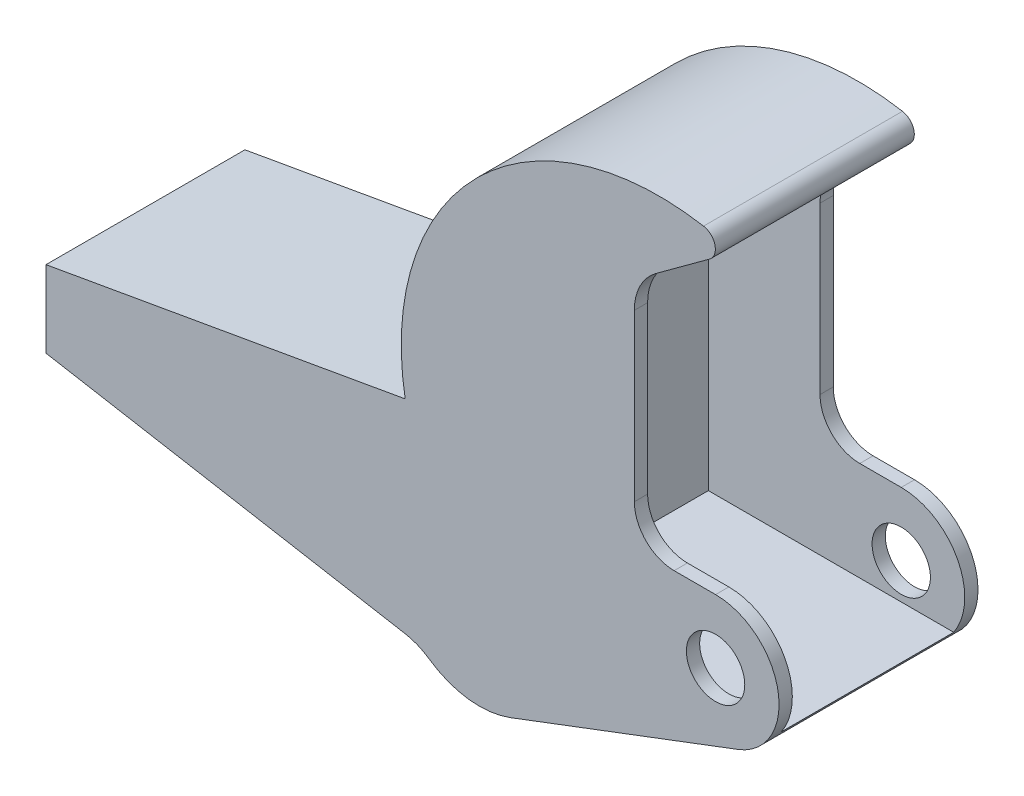
ISO-10303-21;
HEADER;
FILE_DESCRIPTION(('STEP AP214'),'2;1');
FILE_NAME('part.step','',(''),(''),'','','');
FILE_SCHEMA(('AUTOMOTIVE_DESIGN { 1 0 10303 214 1 1 1 1 }'));
ENDSEC;
DATA;
#1=APPLICATION_CONTEXT('core data for automotive mechanical design processes');
#2=APPLICATION_PROTOCOL_DEFINITION('international standard','automotive_design',2000,#1);
#3=PRODUCT_CONTEXT('',#1,'mechanical');
#4=PRODUCT('Part','Part','',(#3));
#5=PRODUCT_RELATED_PRODUCT_CATEGORY('part','',(#4));
#6=PRODUCT_DEFINITION_FORMATION('','',#4);
#7=PRODUCT_DEFINITION_CONTEXT('part definition',#1,'design');
#8=PRODUCT_DEFINITION('design','',#6,#7);
#9=PRODUCT_DEFINITION_SHAPE('','',#8);
#10=(LENGTH_UNIT() NAMED_UNIT(*) SI_UNIT(.MILLI.,.METRE.));
#11=(NAMED_UNIT(*) PLANE_ANGLE_UNIT() SI_UNIT($,.RADIAN.));
#12=(NAMED_UNIT(*) SI_UNIT($,.STERADIAN.) SOLID_ANGLE_UNIT());
#13=UNCERTAINTY_MEASURE_WITH_UNIT(LENGTH_MEASURE(1.E-05),#10,'distance_accuracy_value','');
#14=(GEOMETRIC_REPRESENTATION_CONTEXT(3) GLOBAL_UNCERTAINTY_ASSIGNED_CONTEXT((#13)) GLOBAL_UNIT_ASSIGNED_CONTEXT((#10,
#11,#12)) REPRESENTATION_CONTEXT('',''));
#15=CARTESIAN_POINT('',(0.,0.,0.));
#16=DIRECTION('',(0.,0.,1.));
#17=DIRECTION('',(1.,0.,0.));
#18=AXIS2_PLACEMENT_3D('',#15,#16,#17);
#19=CARTESIAN_POINT('',(52.8386271792986,13.1794672093716,30.));
#20=DIRECTION('',(0.,-1.,0.));
#21=DIRECTION('',(0.,0.,-1.));
#22=AXIS2_PLACEMENT_3D('',#19,#20,#21);
#23=PLANE('',#22);
#24=DIRECTION('',(0.,0.,-1.));
#25=VECTOR('',#24,1.);
#26=CARTESIAN_POINT('',(59.0886271792986,13.1794672093716,30.));
#27=LINE('',#26,#25);
#28=CARTESIAN_POINT('',(59.0886271792986,13.1794672093716,30.));
#29=VERTEX_POINT('',#28);
#30=CARTESIAN_POINT('',(59.0886271792986,13.1794672093716,28.));
#31=VERTEX_POINT('',#30);
#32=EDGE_CURVE('E268',#29,#31,#27,.T.);
#33=ORIENTED_EDGE('',*,*,#32,.T.);
#34=DIRECTION('',(-1.,0.,0.));
#35=VECTOR('',#34,1.);
#36=CARTESIAN_POINT('',(52.8386271792986,13.1794672093716,28.));
#37=LINE('',#36,#35);
#38=CARTESIAN_POINT('',(52.8386271792986,13.1794672093716,28.));
#39=VERTEX_POINT('',#38);
#40=EDGE_CURVE('E385',#31,#39,#37,.T.);
#41=ORIENTED_EDGE('',*,*,#40,.T.);
#42=DIRECTION('',(0.,0.,-1.));
#43=VECTOR('',#42,1.);
#44=CARTESIAN_POINT('',(52.8386271792986,13.1794672093716,30.));
#45=LINE('',#44,#43);
#46=CARTESIAN_POINT('',(52.8386271792986,13.1794672093716,30.));
#47=VERTEX_POINT('',#46);
#48=EDGE_CURVE('E263',#47,#39,#45,.T.);
#49=ORIENTED_EDGE('',*,*,#48,.F.);
#50=DIRECTION('',(-1.,0.,0.));
#51=VECTOR('',#50,1.);
#52=CARTESIAN_POINT('',(52.8386271792986,13.1794672093716,30.));
#53=LINE('',#52,#51);
#54=EDGE_CURVE('E416',#29,#47,#53,.T.);
#55=ORIENTED_EDGE('',*,*,#54,.F.);
#56=EDGE_LOOP('',(#33,#41,#49,#55));
#57=FACE_BOUND('',#56,.T.);
#58=ADVANCED_FACE('F43',(#57),#23,.F.);
#59=CARTESIAN_POINT('',(52.8386271792986,19.1794672093716,30.));
#60=DIRECTION('',(0.,0.,-1.));
#61=DIRECTION('',(-1.,0.,0.));
#62=AXIS2_PLACEMENT_3D('',#59,#60,#61);
#63=CYLINDRICAL_SURFACE('',#62,6.);
#64=ORIENTED_EDGE('',*,*,#48,.T.);
#65=CARTESIAN_POINT('',(52.8386271792986,19.1794672093716,28.));
#66=DIRECTION('',(0.,0.,1.));
#67=DIRECTION('',(0.,-1.,0.));
#68=AXIS2_PLACEMENT_3D('',#65,#66,#67);
#69=CIRCLE('',#68,6.);
#70=CARTESIAN_POINT('',(46.8386271792986,19.1794672093716,28.));
#71=VERTEX_POINT('',#70);
#72=EDGE_CURVE('E381',#39,#71,#69,.F.);
#73=ORIENTED_EDGE('',*,*,#72,.T.);
#74=DIRECTION('',(0.,0.,-1.));
#75=VECTOR('',#74,1.);
#76=CARTESIAN_POINT('',(46.8386271792986,19.1794672093716,30.));
#77=LINE('',#76,#75);
#78=CARTESIAN_POINT('',(46.8386271792986,19.1794672093716,30.));
#79=VERTEX_POINT('',#78);
#80=EDGE_CURVE('E258',#79,#71,#77,.T.);
#81=ORIENTED_EDGE('',*,*,#80,.F.);
#82=CARTESIAN_POINT('',(52.8386271792986,19.1794672093716,30.));
#83=DIRECTION('',(0.,0.,-1.));
#84=DIRECTION('',(1.,0.,0.));
#85=AXIS2_PLACEMENT_3D('',#82,#83,#84);
#86=CIRCLE('',#85,6.);
#87=EDGE_CURVE('E419',#47,#79,#86,.T.);
#88=ORIENTED_EDGE('',*,*,#87,.F.);
#89=EDGE_LOOP('',(#64,#73,#81,#88));
#90=FACE_BOUND('',#89,.T.);
#91=ADVANCED_FACE('F471',(#90),#63,.F.);
#92=CARTESIAN_POINT('',(46.8386271792986,44.1794672093716,30.));
#93=DIRECTION('',(-1.,0.,0.));
#94=DIRECTION('',(0.,0.,1.));
#95=AXIS2_PLACEMENT_3D('',#92,#93,#94);
#96=PLANE('',#95);
#97=ORIENTED_EDGE('',*,*,#80,.T.);
#98=DIRECTION('',(0.,1.,0.));
#99=VECTOR('',#98,1.);
#100=CARTESIAN_POINT('',(46.8386271792986,44.1794672093716,28.));
#101=LINE('',#100,#99);
#102=CARTESIAN_POINT('',(46.8386271792986,44.1794672093716,28.));
#103=VERTEX_POINT('',#102);
#104=EDGE_CURVE('E377',#71,#103,#101,.T.);
#105=ORIENTED_EDGE('',*,*,#104,.T.);
#106=DIRECTION('',(0.,0.,-1.));
#107=VECTOR('',#106,1.);
#108=CARTESIAN_POINT('',(46.8386271792986,44.1794672093716,30.));
#109=LINE('',#108,#107);
#110=CARTESIAN_POINT('',(46.8386271792986,44.1794672093716,30.));
#111=VERTEX_POINT('',#110);
#112=EDGE_CURVE('E253',#111,#103,#109,.T.);
#113=ORIENTED_EDGE('',*,*,#112,.F.);
#114=DIRECTION('',(0.,1.,0.));
#115=VECTOR('',#114,1.);
#116=CARTESIAN_POINT('',(46.8386271792986,44.1794672093716,30.));
#117=LINE('',#116,#115);
#118=EDGE_CURVE('E422',#79,#111,#117,.T.);
#119=ORIENTED_EDGE('',*,*,#118,.F.);
#120=EDGE_LOOP('',(#97,#105,#113,#119));
#121=FACE_BOUND('',#120,.T.);
#122=ADVANCED_FACE('F475',(#121),#96,.F.);
#123=CARTESIAN_POINT('',(54.8386271792986,44.1794672093716,30.));
#124=DIRECTION('',(0.,0.,-1.));
#125=DIRECTION('',(-1.,0.,0.));
#126=AXIS2_PLACEMENT_3D('',#123,#124,#125);
#127=CYLINDRICAL_SURFACE('',#126,8.);
#128=ORIENTED_EDGE('',*,*,#112,.T.);
#129=CARTESIAN_POINT('',(54.8386271792986,44.1794672093716,28.));
#130=DIRECTION('',(0.,0.,1.));
#131=DIRECTION('',(0.,-1.,0.));
#132=AXIS2_PLACEMENT_3D('',#129,#130,#131);
#133=CIRCLE('',#132,8.);
#134=CARTESIAN_POINT('',(50.1104784847501,50.6327307188092,28.));
#135=VERTEX_POINT('',#134);
#136=EDGE_CURVE('E374',#103,#135,#133,.F.);
#137=ORIENTED_EDGE('',*,*,#136,.T.);
#138=DIRECTION('',(0.,0.,-1.));
#139=VECTOR('',#138,1.);
#140=CARTESIAN_POINT('',(50.1104784847501,50.6327307188092,30.));
#141=LINE('',#140,#139);
#142=CARTESIAN_POINT('',(50.1104784847501,50.6327307188092,30.));
#143=VERTEX_POINT('',#142);
#144=EDGE_CURVE('E248',#143,#135,#141,.T.);
#145=ORIENTED_EDGE('',*,*,#144,.F.);
#146=CARTESIAN_POINT('',(54.8386271792986,44.1794672093716,30.));
#147=DIRECTION('',(0.,0.,-1.));
#148=DIRECTION('',(1.,0.,0.));
#149=AXIS2_PLACEMENT_3D('',#146,#147,#148);
#150=CIRCLE('',#149,8.);
#151=EDGE_CURVE('E425',#111,#143,#150,.T.);
#152=ORIENTED_EDGE('',*,*,#151,.F.);
#153=EDGE_LOOP('',(#128,#137,#145,#152));
#154=FACE_BOUND('',#153,.T.);
#155=ADVANCED_FACE('F433',(#154),#127,.F.);
#156=CARTESIAN_POINT('',(59.0886271792986,3.60380984719708,0.));
#157=DIRECTION('',(0.,0.,1.));
#158=DIRECTION('',(1.,0.,0.));
#159=AXIS2_PLACEMENT_3D('',#156,#157,#158);
#160=CYLINDRICAL_SURFACE('',#159,4.39999999999999);
#161=CARTESIAN_POINT('',(59.0886271792986,3.60380984719708,28.));
#162=DIRECTION('',(0.,0.,1.));
#163=DIRECTION('',(0.,-1.,0.));
#164=AXIS2_PLACEMENT_3D('',#161,#162,#163);
#165=CIRCLE('',#164,4.39999999999999);
#166=CARTESIAN_POINT('',(59.0886271792986,-0.796190152802912,28.));
#167=VERTEX_POINT('',#166);
#168=EDGE_CURVE('E297',#167,#167,#165,.F.);
#169=ORIENTED_EDGE('',*,*,#168,.T.);
#170=EDGE_LOOP('',(#169));
#171=FACE_BOUND('',#170,.T.);
#172=CARTESIAN_POINT('',(59.0886271792986,3.60380984719708,30.));
#173=DIRECTION('',(0.,0.,1.));
#174=DIRECTION('',(1.,0.,0.));
#175=AXIS2_PLACEMENT_3D('',#172,#173,#174);
#176=CIRCLE('',#175,4.39999999999999);
#177=CARTESIAN_POINT('',(63.4886271792986,3.60380984719708,30.));
#178=VERTEX_POINT('',#177);
#179=EDGE_CURVE('E393',#178,#178,#176,.T.);
#180=ORIENTED_EDGE('',*,*,#179,.T.);
#181=EDGE_LOOP('',(#180));
#182=FACE_BOUND('',#181,.T.);
#183=ADVANCED_FACE('F546',(#171,#182),#160,.F.);
#184=CARTESIAN_POINT('',(-41.8881042802316,-5.785,30.));
#185=DIRECTION('',(1.,0.,0.));
#186=DIRECTION('',(0.,0.,-1.));
#187=AXIS2_PLACEMENT_3D('',#184,#185,#186);
#188=PLANE('',#187);
#189=DIRECTION('',(0.,-1.,0.));
#190=VECTOR('',#189,1.);
#191=CARTESIAN_POINT('',(-41.8881042802316,-5.785,0.));
#192=LINE('',#191,#190);
#193=CARTESIAN_POINT('',(-41.8881042802316,5.785,0.));
#194=VERTEX_POINT('',#193);
#195=CARTESIAN_POINT('',(-41.8881042802316,-5.785,0.));
#196=VERTEX_POINT('',#195);
#197=EDGE_CURVE('E193',#194,#196,#192,.T.);
#198=ORIENTED_EDGE('',*,*,#197,.T.);
#199=DIRECTION('',(0.,0.,-1.));
#200=VECTOR('',#199,1.);
#201=CARTESIAN_POINT('',(-41.8881042802316,-5.785,30.));
#202=LINE('',#201,#200);
#203=CARTESIAN_POINT('',(-41.8881042802316,-5.785,30.));
#204=VERTEX_POINT('',#203);
#205=EDGE_CURVE('E288',#204,#196,#202,.T.);
#206=ORIENTED_EDGE('',*,*,#205,.F.);
#207=DIRECTION('',(0.,-1.,0.));
#208=VECTOR('',#207,1.);
#209=CARTESIAN_POINT('',(-41.8881042802316,-5.785,30.));
#210=LINE('',#209,#208);
#211=CARTESIAN_POINT('',(-41.8881042802316,5.785,30.));
#212=VERTEX_POINT('',#211);
#213=EDGE_CURVE('E240',#212,#204,#210,.T.);
#214=ORIENTED_EDGE('',*,*,#213,.F.);
#215=DIRECTION('',(0.,0.,-1.));
#216=VECTOR('',#215,1.);
#217=CARTESIAN_POINT('',(-41.8881042802316,5.785,30.));
#218=LINE('',#217,#216);
#219=EDGE_CURVE('E189',#212,#194,#218,.T.);
#220=ORIENTED_EDGE('',*,*,#219,.T.);
#221=EDGE_LOOP('',(#198,#206,#214,#220));
#222=FACE_BOUND('',#221,.T.);
#223=ADVANCED_FACE('F45',(#222),#188,.F.);
#224=CARTESIAN_POINT('',(12.2763221354399,-15.335649771681,30.));
#225=DIRECTION('',(0.173648177666927,0.984807753012208,0.));
#226=DIRECTION('',(-0.984807753012209,0.173648177666927,0.));
#227=AXIS2_PLACEMENT_3D('',#224,#225,#226);
#228=PLANE('',#227);
#229=DIRECTION('',(0.984807753012209,-0.173648177666927,0.));
#230=VECTOR('',#229,1.);
#231=CARTESIAN_POINT('',(12.2763221354399,-15.335649771681,0.));
#232=LINE('',#231,#230);
#233=CARTESIAN_POINT('',(12.2763221354399,-15.335649771681,0.));
#234=VERTEX_POINT('',#233);
#235=EDGE_CURVE('E197',#196,#234,#232,.T.);
#236=ORIENTED_EDGE('',*,*,#235,.T.);
#237=DIRECTION('',(0.,0.,-1.));
#238=VECTOR('',#237,1.);
#239=CARTESIAN_POINT('',(12.2763221354399,-15.335649771681,30.));
#240=LINE('',#239,#238);
#241=CARTESIAN_POINT('',(12.2763221354399,-15.335649771681,30.));
#242=VERTEX_POINT('',#241);
#243=EDGE_CURVE('E284',#242,#234,#240,.T.);
#244=ORIENTED_EDGE('',*,*,#243,.F.);
#245=DIRECTION('',(0.984807753012209,-0.173648177666927,0.));
#246=VECTOR('',#245,1.);
#247=CARTESIAN_POINT('',(12.2763221354399,-15.335649771681,30.));
#248=LINE('',#247,#246);
#249=EDGE_CURVE('E128',#204,#242,#248,.T.);
#250=ORIENTED_EDGE('',*,*,#249,.F.);
#251=ORIENTED_EDGE('',*,*,#205,.T.);
#252=EDGE_LOOP('',(#236,#244,#250,#251));
#253=FACE_BOUND('',#252,.T.);
#254=ADVANCED_FACE('F445',(#253),#228,.F.);
#255=CARTESIAN_POINT('',(10.6874413097875,-24.3466407117427,30.));
#256=DIRECTION('',(0.,0.,-1.));
#257=DIRECTION('',(-1.,0.,0.));
#258=AXIS2_PLACEMENT_3D('',#255,#256,#257);
#259=CYLINDRICAL_SURFACE('',#258,9.15);
#260=CARTESIAN_POINT('',(10.6874413097875,-24.3466407117427,0.));
#261=DIRECTION('',(0.,0.,-1.));
#262=DIRECTION('',(1.,0.,0.));
#263=AXIS2_PLACEMENT_3D('',#260,#261,#262);
#264=CIRCLE('',#263,9.15);
#265=CARTESIAN_POINT('',(15.9157784132082,-16.8375135232477,0.));
#266=VERTEX_POINT('',#265);
#267=EDGE_CURVE('E201',#234,#266,#264,.T.);
#268=ORIENTED_EDGE('',*,*,#267,.T.);
#269=DIRECTION('',(0.,0.,-1.));
#270=VECTOR('',#269,1.);
#271=CARTESIAN_POINT('',(15.9157784132082,-16.8375135232477,30.));
#272=LINE('',#271,#270);
#273=CARTESIAN_POINT('',(15.9157784132082,-16.8375135232477,30.));
#274=VERTEX_POINT('',#273);
#275=EDGE_CURVE('E280',#274,#266,#272,.T.);
#276=ORIENTED_EDGE('',*,*,#275,.F.);
#277=CARTESIAN_POINT('',(10.6874413097875,-24.3466407117427,30.));
#278=DIRECTION('',(0.,0.,-1.));
#279=DIRECTION('',(1.,0.,0.));
#280=AXIS2_PLACEMENT_3D('',#277,#278,#279);
#281=CIRCLE('',#280,9.15);
#282=EDGE_CURVE('E404',#242,#274,#281,.T.);
#283=ORIENTED_EDGE('',*,*,#282,.F.);
#284=ORIENTED_EDGE('',*,*,#243,.T.);
#285=EDGE_LOOP('',(#268,#276,#283,#284));
#286=FACE_BOUND('',#285,.T.);
#287=ADVANCED_FACE('F448',(#286),#259,.F.);
#288=CARTESIAN_POINT('',(23.4811536317098,-5.97184751497741,30.));
#289=DIRECTION('',(0.,0.,-1.));
#290=DIRECTION('',(-1.,0.,0.));
#291=AXIS2_PLACEMENT_3D('',#288,#289,#290);
#292=CYLINDRICAL_SURFACE('',#291,13.24);
#293=CARTESIAN_POINT('',(23.4811536317098,-5.97184751497741,0.));
#294=DIRECTION('',(0.,0.,1.));
#295=DIRECTION('',(-1.,0.,0.));
#296=AXIS2_PLACEMENT_3D('',#293,#294,#295);
#297=CIRCLE('',#296,13.24);
#298=CARTESIAN_POINT('',(28.1731373156714,-18.3525942254726,0.));
#299=VERTEX_POINT('',#298);
#300=EDGE_CURVE('E204',#266,#299,#297,.T.);
#301=ORIENTED_EDGE('',*,*,#300,.T.);
#302=DIRECTION('',(0.,0.,-1.));
#303=VECTOR('',#302,1.);
#304=CARTESIAN_POINT('',(28.1731373156714,-18.3525942254726,30.));
#305=LINE('',#304,#303);
#306=CARTESIAN_POINT('',(28.1731373156714,-18.3525942254726,30.));
#307=VERTEX_POINT('',#306);
#308=EDGE_CURVE('E276',#307,#299,#305,.T.);
#309=ORIENTED_EDGE('',*,*,#308,.F.);
#310=CARTESIAN_POINT('',(23.4811536317098,-5.97184751497741,30.));
#311=DIRECTION('',(0.,0.,1.));
#312=DIRECTION('',(-1.,0.,0.));
#313=AXIS2_PLACEMENT_3D('',#310,#311,#312);
#314=CIRCLE('',#313,13.24);
#315=EDGE_CURVE('E407',#274,#307,#314,.T.);
#316=ORIENTED_EDGE('',*,*,#315,.F.);
#317=ORIENTED_EDGE('',*,*,#275,.T.);
#318=EDGE_LOOP('',(#301,#309,#316,#317));
#319=FACE_BOUND('',#318,.T.);
#320=ADVANCED_FACE('F453',(#319),#292,.T.);
#321=CARTESIAN_POINT('',(28.1731373156714,-18.3525942254726,30.));
#322=DIRECTION('',(-0.354379432323385,0.9351017152942,0.));
#323=DIRECTION('',(-0.9351017152942,-0.354379432323385,0.));
#324=AXIS2_PLACEMENT_3D('',#321,#322,#323);
#325=PLANE('',#324);
#326=DIRECTION('',(0.9351017152942,0.354379432323385,0.));
#327=VECTOR('',#326,1.);
#328=CARTESIAN_POINT('',(28.1731373156714,-18.3525942254726,0.));
#329=LINE('',#328,#327);
#330=CARTESIAN_POINT('',(62.4820431994292,-5.35040377724178,0.));
#331=VERTEX_POINT('',#330);
#332=EDGE_CURVE('E207',#299,#331,#329,.T.);
#333=ORIENTED_EDGE('',*,*,#332,.T.);
#334=DIRECTION('',(0.,0.,-1.));
#335=VECTOR('',#334,1.);
#336=CARTESIAN_POINT('',(62.4820431994292,-5.35040377724178,30.));
#337=LINE('',#336,#335);
#338=CARTESIAN_POINT('',(62.4820431994292,-5.35040377724178,30.));
#339=VERTEX_POINT('',#338);
#340=EDGE_CURVE('E272',#339,#331,#337,.T.);
#341=ORIENTED_EDGE('',*,*,#340,.F.);
#342=DIRECTION('',(0.9351017152942,0.354379432323385,0.));
#343=VECTOR('',#342,1.);
#344=CARTESIAN_POINT('',(28.1731373156714,-18.3525942254726,30.));
#345=LINE('',#344,#343);
#346=EDGE_CURVE('E410',#307,#339,#345,.T.);
#347=ORIENTED_EDGE('',*,*,#346,.F.);
#348=ORIENTED_EDGE('',*,*,#308,.T.);
#349=EDGE_LOOP('',(#333,#341,#347,#348));
#350=FACE_BOUND('',#349,.T.);
#351=ADVANCED_FACE('F459',(#350),#325,.F.);
#352=CARTESIAN_POINT('',(59.0886271792986,3.60380984719708,30.));
#353=DIRECTION('',(0.,0.,-1.));
#354=DIRECTION('',(-1.,0.,0.));
#355=AXIS2_PLACEMENT_3D('',#352,#353,#354);
#356=CYLINDRICAL_SURFACE('',#355,9.57565736217446);
#357=DIRECTION('',(0.,0.,-1.));
#358=VECTOR('',#357,1.);
#359=CARTESIAN_POINT('',(67.0028608201613,-1.7867485464764,30.));
#360=LINE('',#359,#358);
#361=CARTESIAN_POINT('',(67.0028608201613,-1.7867485464764,1.99999999999999));
#362=VERTEX_POINT('',#361);
#363=CARTESIAN_POINT('',(67.0028608201613,-1.7867485464764,28.));
#364=VERTEX_POINT('',#363);
#365=EDGE_CURVE('E11',#362,#364,#360,.F.);
#366=ORIENTED_EDGE('',*,*,#365,.T.);
#367=CARTESIAN_POINT('',(59.0886271792986,3.60380984719708,28.));
#368=DIRECTION('',(0.,0.,1.));
#369=DIRECTION('',(0.,-1.,0.));
#370=AXIS2_PLACEMENT_3D('',#367,#368,#369);
#371=CIRCLE('',#370,9.57565736217446);
#372=EDGE_CURVE('E389',#364,#31,#371,.T.);
#373=ORIENTED_EDGE('',*,*,#372,.T.);
#374=ORIENTED_EDGE('',*,*,#32,.F.);
#375=CARTESIAN_POINT('',(59.0886271792986,3.60380984719708,30.));
#376=DIRECTION('',(0.,0.,1.));
#377=DIRECTION('',(-1.,0.,0.));
#378=AXIS2_PLACEMENT_3D('',#375,#376,#377);
#379=CIRCLE('',#378,9.57565736217446);
#380=EDGE_CURVE('E413',#339,#29,#379,.T.);
#381=ORIENTED_EDGE('',*,*,#380,.F.);
#382=ORIENTED_EDGE('',*,*,#340,.T.);
#383=CARTESIAN_POINT('',(59.0886271792986,3.60380984719708,0.));
#384=DIRECTION('',(0.,0.,1.));
#385=DIRECTION('',(-1.,0.,0.));
#386=AXIS2_PLACEMENT_3D('',#383,#384,#385);
#387=CIRCLE('',#386,9.57565736217446);
#388=CARTESIAN_POINT('',(59.0886271792986,13.1794672093716,0.));
#389=VERTEX_POINT('',#388);
#390=EDGE_CURVE('E210',#331,#389,#387,.T.);
#391=ORIENTED_EDGE('',*,*,#390,.T.);
#392=CARTESIAN_POINT('',(59.0886271792986,13.1794672093716,1.99999999999999));
#393=VERTEX_POINT('',#392);
#394=EDGE_CURVE('E267',#393,#389,#27,.T.);
#395=ORIENTED_EDGE('',*,*,#394,.F.);
#396=CARTESIAN_POINT('',(59.0886271792986,3.60380984719708,1.99999999999999));
#397=DIRECTION('',(0.,0.,-1.));
#398=DIRECTION('',(0.,1.,0.));
#399=AXIS2_PLACEMENT_3D('',#396,#397,#398);
#400=CIRCLE('',#399,9.57565736217446);
#401=EDGE_CURVE('E301',#393,#362,#400,.T.);
#402=ORIENTED_EDGE('',*,*,#401,.T.);
#403=EDGE_LOOP('',(#366,#373,#374,#381,#382,#391,#395,#402));
#404=FACE_BOUND('',#403,.T.);
#405=ADVANCED_FACE('F463',(#404),#356,.T.);
#406=CARTESIAN_POINT('',(52.8386271792986,13.1794672093716,1.99999999999999));
#407=VERTEX_POINT('',#406);
#408=CARTESIAN_POINT('',(52.8386271792986,13.1794672093716,0.));
#409=VERTEX_POINT('',#408);
#410=EDGE_CURVE('E262',#407,#409,#45,.T.);
#411=ORIENTED_EDGE('',*,*,#410,.F.);
#412=DIRECTION('',(1.,0.,0.));
#413=VECTOR('',#412,1.);
#414=CARTESIAN_POINT('',(52.8386271792986,13.1794672093716,1.99999999999999));
#415=LINE('',#414,#413);
#416=EDGE_CURVE('E365',#407,#393,#415,.T.);
#417=ORIENTED_EDGE('',*,*,#416,.T.);
#418=ORIENTED_EDGE('',*,*,#394,.T.);
#419=DIRECTION('',(-1.,0.,0.));
#420=VECTOR('',#419,1.);
#421=CARTESIAN_POINT('',(52.8386271792986,13.1794672093716,0.));
#422=LINE('',#421,#420);
#423=EDGE_CURVE('E214',#389,#409,#422,.T.);
#424=ORIENTED_EDGE('',*,*,#423,.T.);
#425=EDGE_LOOP('',(#411,#417,#418,#424));
#426=FACE_BOUND('',#425,.T.);
#427=ADVANCED_FACE('F503',(#426),#23,.F.);
#428=CARTESIAN_POINT('',(46.8386271792986,19.1794672093716,2.));
#429=VERTEX_POINT('',#428);
#430=CARTESIAN_POINT('',(46.8386271792986,19.1794672093716,0.));
#431=VERTEX_POINT('',#430);
#432=EDGE_CURVE('E257',#429,#431,#77,.T.);
#433=ORIENTED_EDGE('',*,*,#432,.F.);
#434=CARTESIAN_POINT('',(52.8386271792986,19.1794672093716,1.99999999999999));
#435=DIRECTION('',(0.,0.,-1.));
#436=DIRECTION('',(0.,1.,0.));
#437=AXIS2_PLACEMENT_3D('',#434,#435,#436);
#438=CIRCLE('',#437,6.);
#439=EDGE_CURVE('E361',#429,#407,#438,.F.);
#440=ORIENTED_EDGE('',*,*,#439,.T.);
#441=ORIENTED_EDGE('',*,*,#410,.T.);
#442=CARTESIAN_POINT('',(52.8386271792986,19.1794672093716,0.));
#443=DIRECTION('',(0.,0.,-1.));
#444=DIRECTION('',(1.,0.,0.));
#445=AXIS2_PLACEMENT_3D('',#442,#443,#444);
#446=CIRCLE('',#445,6.);
#447=EDGE_CURVE('E218',#409,#431,#446,.T.);
#448=ORIENTED_EDGE('',*,*,#447,.T.);
#449=EDGE_LOOP('',(#433,#440,#441,#448));
#450=FACE_BOUND('',#449,.T.);
#451=ADVANCED_FACE('F521',(#450),#63,.F.);
#452=CARTESIAN_POINT('',(46.8386271792986,44.1794672093716,2.));
#453=VERTEX_POINT('',#452);
#454=CARTESIAN_POINT('',(46.8386271792986,44.1794672093716,0.));
#455=VERTEX_POINT('',#454);
#456=EDGE_CURVE('E252',#453,#455,#109,.T.);
#457=ORIENTED_EDGE('',*,*,#456,.F.);
#458=DIRECTION('',(0.,-1.,0.));
#459=VECTOR('',#458,1.);
#460=CARTESIAN_POINT('',(46.8386271792986,44.1794672093716,2.));
#461=LINE('',#460,#459);
#462=EDGE_CURVE('E357',#453,#429,#461,.T.);
#463=ORIENTED_EDGE('',*,*,#462,.T.);
#464=ORIENTED_EDGE('',*,*,#432,.T.);
#465=DIRECTION('',(0.,1.,0.));
#466=VECTOR('',#465,1.);
#467=CARTESIAN_POINT('',(46.8386271792986,44.1794672093716,0.));
#468=LINE('',#467,#466);
#469=EDGE_CURVE('E222',#431,#455,#468,.T.);
#470=ORIENTED_EDGE('',*,*,#469,.T.);
#471=EDGE_LOOP('',(#457,#463,#464,#470));
#472=FACE_BOUND('',#471,.T.);
#473=ADVANCED_FACE('F519',(#472),#96,.F.);
#474=CARTESIAN_POINT('',(50.1104784847501,50.6327307188092,2.));
#475=VERTEX_POINT('',#474);
#476=CARTESIAN_POINT('',(50.1104784847501,50.6327307188092,0.));
#477=VERTEX_POINT('',#476);
#478=EDGE_CURVE('E247',#475,#477,#141,.T.);
#479=ORIENTED_EDGE('',*,*,#478,.F.);
#480=CARTESIAN_POINT('',(54.8386271792986,44.1794672093716,2.));
#481=DIRECTION('',(0.,0.,-1.));
#482=DIRECTION('',(0.,1.,0.));
#483=AXIS2_PLACEMENT_3D('',#480,#481,#482);
#484=CIRCLE('',#483,8.);
#485=EDGE_CURVE('E59',#475,#453,#484,.F.);
#486=ORIENTED_EDGE('',*,*,#485,.T.);
#487=ORIENTED_EDGE('',*,*,#456,.T.);
#488=CARTESIAN_POINT('',(54.8386271792986,44.1794672093716,0.));
#489=DIRECTION('',(0.,0.,-1.));
#490=DIRECTION('',(1.,0.,0.));
#491=AXIS2_PLACEMENT_3D('',#488,#489,#490);
#492=CIRCLE('',#491,8.);
#493=EDGE_CURVE('E226',#455,#477,#492,.T.);
#494=ORIENTED_EDGE('',*,*,#493,.T.);
#495=EDGE_LOOP('',(#479,#486,#487,#494));
#496=FACE_BOUND('',#495,.T.);
#497=ADVANCED_FACE('F515',(#496),#127,.F.);
#498=CARTESIAN_POINT('',(58.1770578715472,56.5429165869948,30.));
#499=DIRECTION('',(-0.591018586818561,0.806657938679705,0.));
#500=DIRECTION('',(-0.806657938679705,-0.591018586818561,0.));
#501=AXIS2_PLACEMENT_3D('',#498,#499,#500);
#502=PLANE('',#501);
#503=ORIENTED_EDGE('',*,*,#144,.T.);
#504=DIRECTION('',(0.806657938679705,0.591018586818561,0.));
#505=VECTOR('',#504,1.);
#506=CARTESIAN_POINT('',(58.1770578715472,56.5429165869948,28.));
#507=LINE('',#506,#505);
#508=CARTESIAN_POINT('',(51.2515432714417,51.4687610426447,28.));
#509=VERTEX_POINT('',#508);
#510=EDGE_CURVE('E300',#135,#509,#507,.T.);
#511=ORIENTED_EDGE('',*,*,#510,.T.);
#512=DIRECTION('',(0.,0.,-1.));
#513=VECTOR('',#512,1.);
#514=CARTESIAN_POINT('',(51.2515432714417,51.4687610426447,30.));
#515=LINE('',#514,#513);
#516=CARTESIAN_POINT('',(51.2515432714417,51.4687610426447,2.));
#517=VERTEX_POINT('',#516);
#518=EDGE_CURVE('E52',#509,#517,#515,.T.);
#519=ORIENTED_EDGE('',*,*,#518,.T.);
#520=DIRECTION('',(-0.806657938679705,-0.591018586818561,0.));
#521=VECTOR('',#520,1.);
#522=CARTESIAN_POINT('',(58.1770578715472,56.5429165869948,2.));
#523=LINE('',#522,#521);
#524=EDGE_CURVE('E295',#517,#475,#523,.T.);
#525=ORIENTED_EDGE('',*,*,#524,.T.);
#526=ORIENTED_EDGE('',*,*,#478,.T.);
#527=DIRECTION('',(0.806657938679705,0.591018586818561,0.));
#528=VECTOR('',#527,1.);
#529=CARTESIAN_POINT('',(58.1770578715472,56.5429165869948,0.));
#530=LINE('',#529,#528);
#531=CARTESIAN_POINT('',(58.1770578715471,56.5429165869949,0.));
#532=VERTEX_POINT('',#531);
#533=EDGE_CURVE('E230',#477,#532,#530,.T.);
#534=ORIENTED_EDGE('',*,*,#533,.T.);
#535=DIRECTION('',(0.,0.,-1.));
#536=VECTOR('',#535,1.);
#537=CARTESIAN_POINT('',(58.1770578715471,56.5429165869949,30.));
#538=LINE('',#537,#536);
#539=CARTESIAN_POINT('',(58.1770578715471,56.5429165869949,30.));
#540=VERTEX_POINT('',#539);
#541=EDGE_CURVE('E182',#540,#532,#538,.T.);
#542=ORIENTED_EDGE('',*,*,#541,.F.);
#543=DIRECTION('',(0.806657938679705,0.591018586818561,0.));
#544=VECTOR('',#543,1.);
#545=CARTESIAN_POINT('',(58.1770578715472,56.5429165869948,30.));
#546=LINE('',#545,#544);
#547=EDGE_CURVE('E168',#143,#540,#546,.T.);
#548=ORIENTED_EDGE('',*,*,#547,.F.);
#549=EDGE_LOOP('',(#503,#511,#519,#525,#526,#534,#542,#548));
#550=FACE_BOUND('',#549,.T.);
#551=ADVANCED_FACE('F308',(#550),#502,.F.);
#552=CARTESIAN_POINT('',(56.9056689790094,58.2781850983212,30.));
#553=DIRECTION('',(0.,0.,-1.));
#554=DIRECTION('',(-1.,0.,0.));
#555=AXIS2_PLACEMENT_3D('',#552,#553,#554);
#556=CYLINDRICAL_SURFACE('',#555,2.15118258696681);
#557=CARTESIAN_POINT('',(56.9056689790094,58.2781850983212,0.));
#558=DIRECTION('',(0.,0.,1.));
#559=DIRECTION('',(-1.,0.,0.));
#560=AXIS2_PLACEMENT_3D('',#557,#558,#559);
#561=CIRCLE('',#560,2.15118258696681);
#562=CARTESIAN_POINT('',(57.2763221354398,60.3971949520258,0.));
#563=VERTEX_POINT('',#562);
#564=EDGE_CURVE('E178',#532,#563,#561,.T.);
#565=ORIENTED_EDGE('',*,*,#564,.T.);
#566=DIRECTION('',(0.,0.,-1.));
#567=VECTOR('',#566,1.);
#568=CARTESIAN_POINT('',(57.2763221354398,60.3971949520258,30.));
#569=LINE('',#568,#567);
#570=CARTESIAN_POINT('',(57.2763221354398,60.3971949520258,30.));
#571=VERTEX_POINT('',#570);
#572=EDGE_CURVE('E175',#571,#563,#569,.T.);
#573=ORIENTED_EDGE('',*,*,#572,.F.);
#574=CARTESIAN_POINT('',(56.9056689790094,58.2781850983212,30.));
#575=DIRECTION('',(0.,0.,1.));
#576=DIRECTION('',(-1.,0.,0.));
#577=AXIS2_PLACEMENT_3D('',#574,#575,#576);
#578=CIRCLE('',#577,2.15118258696681);
#579=EDGE_CURVE('E161',#540,#571,#578,.T.);
#580=ORIENTED_EDGE('',*,*,#579,.F.);
#581=ORIENTED_EDGE('',*,*,#541,.T.);
#582=EDGE_LOOP('',(#565,#573,#580,#581));
#583=FACE_BOUND('',#582,.T.);
#584=ADVANCED_FACE('F176',(#583),#556,.T.);
#585=CARTESIAN_POINT('',(50.5754956500846,22.0888274011478,30.));
#586=DIRECTION('',(0.,0.,-1.));
#587=DIRECTION('',(-1.,0.,0.));
#588=AXIS2_PLACEMENT_3D('',#585,#586,#587);
#589=CYLINDRICAL_SURFACE('',#588,38.89);
#590=CARTESIAN_POINT('',(50.5754956500846,22.0888274011478,0.));
#591=DIRECTION('',(0.,0.,1.));
#592=DIRECTION('',(-1.,0.,0.));
#593=AXIS2_PLACEMENT_3D('',#590,#591,#592);
#594=CIRCLE('',#593,38.89);
#595=CARTESIAN_POINT('',(12.2763221354399,15.335649771681,0.));
#596=VERTEX_POINT('',#595);
#597=EDGE_CURVE('E235',#563,#596,#594,.T.);
#598=ORIENTED_EDGE('',*,*,#597,.T.);
#599=DIRECTION('',(0.,0.,-1.));
#600=VECTOR('',#599,1.);
#601=CARTESIAN_POINT('',(12.2763221354399,15.335649771681,30.));
#602=LINE('',#601,#600);
#603=CARTESIAN_POINT('',(12.2763221354399,15.335649771681,30.));
#604=VERTEX_POINT('',#603);
#605=EDGE_CURVE('E183',#604,#596,#602,.T.);
#606=ORIENTED_EDGE('',*,*,#605,.F.);
#607=CARTESIAN_POINT('',(50.5754956500846,22.0888274011478,30.));
#608=DIRECTION('',(0.,0.,1.));
#609=DIRECTION('',(-1.,0.,0.));
#610=AXIS2_PLACEMENT_3D('',#607,#608,#609);
#611=CIRCLE('',#610,38.89);
#612=EDGE_CURVE('E165',#571,#604,#611,.T.);
#613=ORIENTED_EDGE('',*,*,#612,.F.);
#614=ORIENTED_EDGE('',*,*,#572,.T.);
#615=EDGE_LOOP('',(#598,#606,#613,#614));
#616=FACE_BOUND('',#615,.T.);
#617=ADVANCED_FACE('F185',(#616),#589,.T.);
#618=CARTESIAN_POINT('',(-41.8881042802316,5.785,30.));
#619=DIRECTION('',(0.173648177666927,-0.984807753012208,0.));
#620=DIRECTION('',(0.984807753012209,0.173648177666927,0.));
#621=AXIS2_PLACEMENT_3D('',#618,#619,#620);
#622=PLANE('',#621);
#623=DIRECTION('',(-0.984807753012209,-0.173648177666927,0.));
#624=VECTOR('',#623,1.);
#625=CARTESIAN_POINT('',(-41.8881042802316,5.785,0.));
#626=LINE('',#625,#624);
#627=EDGE_CURVE('E119',#596,#194,#626,.T.);
#628=ORIENTED_EDGE('',*,*,#627,.T.);
#629=ORIENTED_EDGE('',*,*,#219,.F.);
#630=DIRECTION('',(-0.984807753012209,-0.173648177666927,0.));
#631=VECTOR('',#630,1.);
#632=CARTESIAN_POINT('',(-41.8881042802316,5.785,30.));
#633=LINE('',#632,#631);
#634=EDGE_CURVE('E68',#604,#212,#633,.T.);
#635=ORIENTED_EDGE('',*,*,#634,.F.);
#636=ORIENTED_EDGE('',*,*,#605,.T.);
#637=EDGE_LOOP('',(#628,#629,#635,#636));
#638=FACE_BOUND('',#637,.T.);
#639=ADVANCED_FACE('F439',(#638),#622,.F.);
#640=CARTESIAN_POINT('',(50.5754956500846,22.0888274011478,30.));
#641=DIRECTION('',(0.,0.,-1.));
#642=DIRECTION('',(-1.,0.,0.));
#643=AXIS2_PLACEMENT_3D('',#640,#641,#642);
#644=PLANE('',#643);
#645=ORIENTED_EDGE('',*,*,#179,.F.);
#646=EDGE_LOOP('',(#645));
#647=FACE_BOUND('',#646,.T.);
#648=ORIENTED_EDGE('',*,*,#213,.T.);
#649=ORIENTED_EDGE('',*,*,#249,.T.);
#650=ORIENTED_EDGE('',*,*,#282,.T.);
#651=ORIENTED_EDGE('',*,*,#315,.T.);
#652=ORIENTED_EDGE('',*,*,#346,.T.);
#653=ORIENTED_EDGE('',*,*,#380,.T.);
#654=ORIENTED_EDGE('',*,*,#54,.T.);
#655=ORIENTED_EDGE('',*,*,#87,.T.);
#656=ORIENTED_EDGE('',*,*,#118,.T.);
#657=ORIENTED_EDGE('',*,*,#151,.T.);
#658=ORIENTED_EDGE('',*,*,#547,.T.);
#659=ORIENTED_EDGE('',*,*,#579,.T.);
#660=ORIENTED_EDGE('',*,*,#612,.T.);
#661=ORIENTED_EDGE('',*,*,#634,.T.);
#662=EDGE_LOOP('',(#648,#649,#650,#651,#652,#653,#654,#655,#656,#657,#658,#659,#660,#661));
#663=FACE_BOUND('',#662,.T.);
#664=ADVANCED_FACE('F163',(#647,#663),#644,.F.);
#665=CARTESIAN_POINT('',(50.5754956500846,22.0888274011478,0.));
#666=DIRECTION('',(0.,0.,-1.));
#667=DIRECTION('',(-1.,0.,0.));
#668=AXIS2_PLACEMENT_3D('',#665,#666,#667);
#669=PLANE('',#668);
#670=CARTESIAN_POINT('',(59.0886271792986,3.60380984719708,0.));
#671=DIRECTION('',(0.,0.,1.));
#672=DIRECTION('',(1.,0.,0.));
#673=AXIS2_PLACEMENT_3D('',#670,#671,#672);
#674=CIRCLE('',#673,4.39999999999999);
#675=CARTESIAN_POINT('',(63.4886271792986,3.60380984719708,0.));
#676=VERTEX_POINT('',#675);
#677=EDGE_CURVE('E198',#676,#676,#674,.T.);
#678=ORIENTED_EDGE('',*,*,#677,.T.);
#679=EDGE_LOOP('',(#678));
#680=FACE_BOUND('',#679,.T.);
#681=ORIENTED_EDGE('',*,*,#197,.F.);
#682=ORIENTED_EDGE('',*,*,#627,.F.);
#683=ORIENTED_EDGE('',*,*,#597,.F.);
#684=ORIENTED_EDGE('',*,*,#564,.F.);
#685=ORIENTED_EDGE('',*,*,#533,.F.);
#686=ORIENTED_EDGE('',*,*,#493,.F.);
#687=ORIENTED_EDGE('',*,*,#469,.F.);
#688=ORIENTED_EDGE('',*,*,#447,.F.);
#689=ORIENTED_EDGE('',*,*,#423,.F.);
#690=ORIENTED_EDGE('',*,*,#390,.F.);
#691=ORIENTED_EDGE('',*,*,#332,.F.);
#692=ORIENTED_EDGE('',*,*,#300,.F.);
#693=ORIENTED_EDGE('',*,*,#267,.F.);
#694=ORIENTED_EDGE('',*,*,#235,.F.);
#695=EDGE_LOOP('',(#681,#682,#683,#684,#685,#686,#687,#688,#689,#690,#691,#692,#693,#694));
#696=FACE_BOUND('',#695,.T.);
#697=ADVANCED_FACE('F437',(#680,#696),#669,.T.);
#698=CARTESIAN_POINT('',(59.0886271792986,3.60380984719708,1.99999999999999));
#699=DIRECTION('',(0.,0.,-1.));
#700=DIRECTION('',(0.,1.,0.));
#701=AXIS2_PLACEMENT_3D('',#698,#699,#700);
#702=CIRCLE('',#701,4.39999999999999);
#703=CARTESIAN_POINT('',(59.0886271792986,8.00380984719707,1.99999999999999));
#704=VERTEX_POINT('',#703);
#705=EDGE_CURVE('E291',#704,#704,#702,.F.);
#706=ORIENTED_EDGE('',*,*,#705,.T.);
#707=EDGE_LOOP('',(#706));
#708=FACE_BOUND('',#707,.T.);
#709=ORIENTED_EDGE('',*,*,#677,.F.);
#710=EDGE_LOOP('',(#709));
#711=FACE_BOUND('',#710,.T.);
#712=ADVANCED_FACE('F552',(#708,#711),#160,.F.);
#713=CARTESIAN_POINT('',(30.,-1.7867485464764,28.));
#714=DIRECTION('',(0.,-1.,0.));
#715=DIRECTION('',(0.,0.,-1.));
#716=AXIS2_PLACEMENT_3D('',#713,#714,#715);
#717=PLANE('',#716);
#718=DIRECTION('',(1.,0.,0.));
#719=VECTOR('',#718,1.);
#720=CARTESIAN_POINT('',(30.,-1.7867485464764,1.99999999999999));
#721=LINE('',#720,#719);
#722=CARTESIAN_POINT('',(30.,-1.7867485464764,1.99999999999999));
#723=VERTEX_POINT('',#722);
#724=EDGE_CURVE('E340',#723,#362,#721,.T.);
#725=ORIENTED_EDGE('',*,*,#724,.F.);
#726=DIRECTION('',(0.,0.,-1.));
#727=VECTOR('',#726,1.);
#728=CARTESIAN_POINT('',(30.,-1.7867485464764,28.));
#729=LINE('',#728,#727);
#730=CARTESIAN_POINT('',(30.,-1.7867485464764,28.));
#731=VERTEX_POINT('',#730);
#732=EDGE_CURVE('E491',#731,#723,#729,.T.);
#733=ORIENTED_EDGE('',*,*,#732,.F.);
#734=DIRECTION('',(1.,0.,0.));
#735=VECTOR('',#734,1.);
#736=CARTESIAN_POINT('',(30.,-1.7867485464764,28.));
#737=LINE('',#736,#735);
#738=EDGE_CURVE('E349',#731,#364,#737,.T.);
#739=ORIENTED_EDGE('',*,*,#738,.T.);
#740=ORIENTED_EDGE('',*,*,#365,.F.);
#741=EDGE_LOOP('',(#725,#733,#739,#740));
#742=FACE_BOUND('',#741,.T.);
#743=ADVANCED_FACE('F489',(#742),#717,.F.);
#744=CARTESIAN_POINT('',(30.,51.4687610426447,28.));
#745=DIRECTION('',(0.,1.,0.));
#746=DIRECTION('',(0.,0.,1.));
#747=AXIS2_PLACEMENT_3D('',#744,#745,#746);
#748=PLANE('',#747);
#749=DIRECTION('',(1.,0.,0.));
#750=VECTOR('',#749,1.);
#751=CARTESIAN_POINT('',(30.,51.4687610426447,28.));
#752=LINE('',#751,#750);
#753=CARTESIAN_POINT('',(30.,51.4687610426447,28.));
#754=VERTEX_POINT('',#753);
#755=EDGE_CURVE('E296',#754,#509,#752,.T.);
#756=ORIENTED_EDGE('',*,*,#755,.F.);
#757=DIRECTION('',(0.,0.,1.));
#758=VECTOR('',#757,1.);
#759=CARTESIAN_POINT('',(30.,51.4687610426447,28.));
#760=LINE('',#759,#758);
#761=CARTESIAN_POINT('',(30.,51.4687610426447,2.));
#762=VERTEX_POINT('',#761);
#763=EDGE_CURVE('E343',#762,#754,#760,.T.);
#764=ORIENTED_EDGE('',*,*,#763,.F.);
#765=DIRECTION('',(1.,0.,0.));
#766=VECTOR('',#765,1.);
#767=CARTESIAN_POINT('',(30.,51.4687610426447,2.));
#768=LINE('',#767,#766);
#769=EDGE_CURVE('E324',#762,#517,#768,.T.);
#770=ORIENTED_EDGE('',*,*,#769,.T.);
#771=ORIENTED_EDGE('',*,*,#518,.F.);
#772=EDGE_LOOP('',(#756,#764,#770,#771));
#773=FACE_BOUND('',#772,.T.);
#774=ADVANCED_FACE('F319',(#773),#748,.F.);
#775=CARTESIAN_POINT('',(30.,51.4687610426447,28.));
#776=DIRECTION('',(0.,0.,1.));
#777=DIRECTION('',(0.,-1.,0.));
#778=AXIS2_PLACEMENT_3D('',#775,#776,#777);
#779=PLANE('',#778);
#780=ORIENTED_EDGE('',*,*,#168,.F.);
#781=EDGE_LOOP('',(#780));
#782=FACE_BOUND('',#781,.T.);
#783=ORIENTED_EDGE('',*,*,#738,.F.);
#784=DIRECTION('',(0.,-1.,0.));
#785=VECTOR('',#784,1.);
#786=CARTESIAN_POINT('',(30.,51.4687610426447,28.));
#787=LINE('',#786,#785);
#788=EDGE_CURVE('E335',#754,#731,#787,.T.);
#789=ORIENTED_EDGE('',*,*,#788,.F.);
#790=ORIENTED_EDGE('',*,*,#755,.T.);
#791=ORIENTED_EDGE('',*,*,#510,.F.);
#792=ORIENTED_EDGE('',*,*,#136,.F.);
#793=ORIENTED_EDGE('',*,*,#104,.F.);
#794=ORIENTED_EDGE('',*,*,#72,.F.);
#795=ORIENTED_EDGE('',*,*,#40,.F.);
#796=ORIENTED_EDGE('',*,*,#372,.F.);
#797=EDGE_LOOP('',(#783,#789,#790,#791,#792,#793,#794,#795,#796));
#798=FACE_BOUND('',#797,.T.);
#799=ADVANCED_FACE('F330',(#782,#798),#779,.F.);
#800=CARTESIAN_POINT('',(30.,51.4687610426447,2.));
#801=DIRECTION('',(0.,0.,-1.));
#802=DIRECTION('',(0.,1.,0.));
#803=AXIS2_PLACEMENT_3D('',#800,#801,#802);
#804=PLANE('',#803);
#805=ORIENTED_EDGE('',*,*,#705,.F.);
#806=EDGE_LOOP('',(#805));
#807=FACE_BOUND('',#806,.T.);
#808=ORIENTED_EDGE('',*,*,#416,.F.);
#809=ORIENTED_EDGE('',*,*,#439,.F.);
#810=ORIENTED_EDGE('',*,*,#462,.F.);
#811=ORIENTED_EDGE('',*,*,#485,.F.);
#812=ORIENTED_EDGE('',*,*,#524,.F.);
#813=ORIENTED_EDGE('',*,*,#769,.F.);
#814=DIRECTION('',(0.,1.,0.));
#815=VECTOR('',#814,1.);
#816=CARTESIAN_POINT('',(30.,51.4687610426447,2.));
#817=LINE('',#816,#815);
#818=EDGE_CURVE('E807',#723,#762,#817,.T.);
#819=ORIENTED_EDGE('',*,*,#818,.F.);
#820=ORIENTED_EDGE('',*,*,#724,.T.);
#821=ORIENTED_EDGE('',*,*,#401,.F.);
#822=EDGE_LOOP('',(#808,#809,#810,#811,#812,#813,#819,#820,#821));
#823=FACE_BOUND('',#822,.T.);
#824=ADVANCED_FACE('F496',(#807,#823),#804,.F.);
#825=CARTESIAN_POINT('',(30.,0.,0.));
#826=DIRECTION('',(1.,0.,0.));
#827=DIRECTION('',(0.,0.,-1.));
#828=AXIS2_PLACEMENT_3D('',#825,#826,#827);
#829=PLANE('',#828);
#830=ORIENTED_EDGE('',*,*,#788,.T.);
#831=ORIENTED_EDGE('',*,*,#732,.T.);
#832=ORIENTED_EDGE('',*,*,#818,.T.);
#833=ORIENTED_EDGE('',*,*,#763,.T.);
#834=EDGE_LOOP('',(#830,#831,#832,#833));
#835=FACE_BOUND('',#834,.T.);
#836=ADVANCED_FACE('F574',(#835),#829,.T.);
#837=CLOSED_SHELL('',(#58,#91,#122,#155,#183,#223,#254,#287,#320,#351,#405,#427,#451,#473,#497,
#551,#584,#617,#639,#664,#697,#712,#743,#774,#799,#824,#836));
#838=MANIFOLD_SOLID_BREP('B2',#837);
#839=ADVANCED_BREP_SHAPE_REPRESENTATION('',(#18,#838),#14);
#840=SHAPE_DEFINITION_REPRESENTATION(#9,#839);
ENDSEC;
END-ISO-10303-21;
